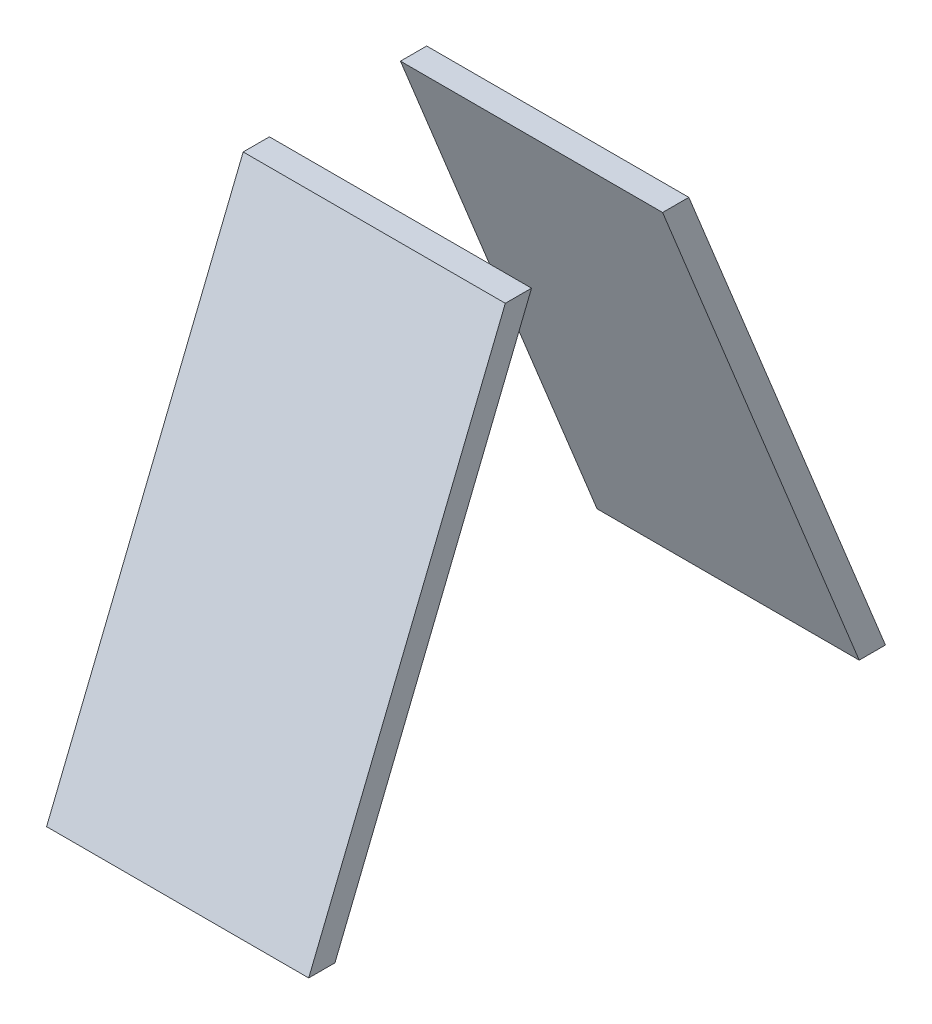
ISO-10303-21;
HEADER;
FILE_DESCRIPTION(('STEP AP214'),'2;1');
FILE_NAME('part.step','',(''),(''),'','','');
FILE_SCHEMA(('AUTOMOTIVE_DESIGN { 1 0 10303 214 1 1 1 1 }'));
ENDSEC;
DATA;
#1=APPLICATION_CONTEXT('core data for automotive mechanical design processes');
#2=APPLICATION_PROTOCOL_DEFINITION('international standard','automotive_design',2000,#1);
#3=PRODUCT_CONTEXT('',#1,'mechanical');
#4=PRODUCT('Part','Part','',(#3));
#5=PRODUCT_RELATED_PRODUCT_CATEGORY('part','',(#4));
#6=PRODUCT_DEFINITION_FORMATION('','',#4);
#7=PRODUCT_DEFINITION_CONTEXT('part definition',#1,'design');
#8=PRODUCT_DEFINITION('design','',#6,#7);
#9=PRODUCT_DEFINITION_SHAPE('','',#8);
#10=(LENGTH_UNIT() NAMED_UNIT(*) SI_UNIT(.MILLI.,.METRE.));
#11=(NAMED_UNIT(*) PLANE_ANGLE_UNIT() SI_UNIT($,.RADIAN.));
#12=(NAMED_UNIT(*) SI_UNIT($,.STERADIAN.) SOLID_ANGLE_UNIT());
#13=UNCERTAINTY_MEASURE_WITH_UNIT(LENGTH_MEASURE(1.E-05),#10,'distance_accuracy_value','');
#14=(GEOMETRIC_REPRESENTATION_CONTEXT(3) GLOBAL_UNCERTAINTY_ASSIGNED_CONTEXT((#13)) GLOBAL_UNIT_ASSIGNED_CONTEXT((#10,
#11,#12)) REPRESENTATION_CONTEXT('',''));
#15=CARTESIAN_POINT('',(0.,0.,0.));
#16=DIRECTION('',(0.,0.,1.));
#17=DIRECTION('',(1.,0.,0.));
#18=AXIS2_PLACEMENT_3D('',#15,#16,#17);
#19=CARTESIAN_POINT('',(100.,50.,-25.));
#20=DIRECTION('',(0.,0.375,-0.927024810886958));
#21=DIRECTION('',(0.,0.927024810886958,0.375));
#22=AXIS2_PLACEMENT_3D('',#19,#20,#21);
#23=PLANE('',#22);
#24=DIRECTION('',(0.,-0.927024810886958,-0.375));
#25=VECTOR('',#24,1.);
#26=CARTESIAN_POINT('',(0.,50.,-25.));
#27=LINE('',#26,#25);
#28=CARTESIAN_POINT('',(0.,50.,-25.));
#29=VERTEX_POINT('',#28);
#30=CARTESIAN_POINT('',(0.,-135.404962177392,-100.));
#31=VERTEX_POINT('',#30);
#32=EDGE_CURVE('E110',#29,#31,#27,.T.);
#33=ORIENTED_EDGE('',*,*,#32,.T.);
#34=DIRECTION('',(-1.,0.,0.));
#35=VECTOR('',#34,1.);
#36=CARTESIAN_POINT('',(100.,-135.404962177392,-100.));
#37=LINE('',#36,#35);
#38=CARTESIAN_POINT('',(100.,-135.404962177392,-100.));
#39=VERTEX_POINT('',#38);
#40=EDGE_CURVE('E12',#39,#31,#37,.T.);
#41=ORIENTED_EDGE('',*,*,#40,.F.);
#42=DIRECTION('',(0.,-0.927024810886958,-0.375));
#43=VECTOR('',#42,1.);
#44=CARTESIAN_POINT('',(100.,50.,-25.));
#45=LINE('',#44,#43);
#46=CARTESIAN_POINT('',(100.,50.,-25.));
#47=VERTEX_POINT('',#46);
#48=EDGE_CURVE('E98',#47,#39,#45,.T.);
#49=ORIENTED_EDGE('',*,*,#48,.F.);
#50=DIRECTION('',(-1.,0.,0.));
#51=VECTOR('',#50,1.);
#52=CARTESIAN_POINT('',(100.,50.,-25.));
#53=LINE('',#52,#51);
#54=EDGE_CURVE('E106',#47,#29,#53,.T.);
#55=ORIENTED_EDGE('',*,*,#54,.T.);
#56=EDGE_LOOP('',(#33,#41,#49,#55));
#57=FACE_BOUND('',#56,.T.);
#58=ADVANCED_FACE('F47',(#57),#23,.F.);
#59=CARTESIAN_POINT('',(100.,-135.404962177392,-110.));
#60=DIRECTION('',(0.,1.,0.));
#61=DIRECTION('',(0.,0.,1.));
#62=AXIS2_PLACEMENT_3D('',#59,#60,#61);
#63=PLANE('',#62);
#64=DIRECTION('',(0.,0.,-1.));
#65=VECTOR('',#64,1.);
#66=CARTESIAN_POINT('',(0.,-135.404962177392,-110.));
#67=LINE('',#66,#65);
#68=CARTESIAN_POINT('',(0.,-135.404962177392,-110.));
#69=VERTEX_POINT('',#68);
#70=EDGE_CURVE('E102',#31,#69,#67,.T.);
#71=ORIENTED_EDGE('',*,*,#70,.T.);
#72=DIRECTION('',(-1.,0.,0.));
#73=VECTOR('',#72,1.);
#74=CARTESIAN_POINT('',(100.,-135.404962177392,-110.));
#75=LINE('',#74,#73);
#76=CARTESIAN_POINT('',(100.,-135.404962177392,-110.));
#77=VERTEX_POINT('',#76);
#78=EDGE_CURVE('E55',#77,#69,#75,.T.);
#79=ORIENTED_EDGE('',*,*,#78,.F.);
#80=DIRECTION('',(0.,0.,-1.));
#81=VECTOR('',#80,1.);
#82=CARTESIAN_POINT('',(100.,-135.404962177392,-110.));
#83=LINE('',#82,#81);
#84=EDGE_CURVE('E93',#39,#77,#83,.T.);
#85=ORIENTED_EDGE('',*,*,#84,.F.);
#86=ORIENTED_EDGE('',*,*,#40,.T.);
#87=EDGE_LOOP('',(#71,#79,#85,#86));
#88=FACE_BOUND('',#87,.T.);
#89=ADVANCED_FACE('F101',(#88),#63,.F.);
#90=CARTESIAN_POINT('',(100.,50.,-35.));
#91=DIRECTION('',(0.,-0.375,0.927024810886958));
#92=DIRECTION('',(0.,-0.927024810886958,-0.375));
#93=AXIS2_PLACEMENT_3D('',#90,#91,#92);
#94=PLANE('',#93);
#95=DIRECTION('',(0.,0.927024810886958,0.375));
#96=VECTOR('',#95,1.);
#97=CARTESIAN_POINT('',(0.,50.,-35.));
#98=LINE('',#97,#96);
#99=CARTESIAN_POINT('',(0.,50.,-35.));
#100=VERTEX_POINT('',#99);
#101=EDGE_CURVE('E80',#69,#100,#98,.T.);
#102=ORIENTED_EDGE('',*,*,#101,.T.);
#103=DIRECTION('',(-1.,0.,0.));
#104=VECTOR('',#103,1.);
#105=CARTESIAN_POINT('',(100.,50.,-35.));
#106=LINE('',#105,#104);
#107=CARTESIAN_POINT('',(100.,50.,-35.));
#108=VERTEX_POINT('',#107);
#109=EDGE_CURVE('E103',#108,#100,#106,.T.);
#110=ORIENTED_EDGE('',*,*,#109,.F.);
#111=DIRECTION('',(0.,0.927024810886958,0.375));
#112=VECTOR('',#111,1.);
#113=CARTESIAN_POINT('',(100.,50.,-35.));
#114=LINE('',#113,#112);
#115=EDGE_CURVE('E96',#77,#108,#114,.T.);
#116=ORIENTED_EDGE('',*,*,#115,.F.);
#117=ORIENTED_EDGE('',*,*,#78,.T.);
#118=EDGE_LOOP('',(#102,#110,#116,#117));
#119=FACE_BOUND('',#118,.T.);
#120=ADVANCED_FACE('F104',(#119),#94,.F.);
#121=CARTESIAN_POINT('',(100.,50.,-25.));
#122=DIRECTION('',(0.,-1.,0.));
#123=DIRECTION('',(0.,0.,-1.));
#124=AXIS2_PLACEMENT_3D('',#121,#122,#123);
#125=PLANE('',#124);
#126=DIRECTION('',(0.,0.,1.));
#127=VECTOR('',#126,1.);
#128=CARTESIAN_POINT('',(0.,50.,-25.));
#129=LINE('',#128,#127);
#130=EDGE_CURVE('E86',#100,#29,#129,.T.);
#131=ORIENTED_EDGE('',*,*,#130,.T.);
#132=ORIENTED_EDGE('',*,*,#54,.F.);
#133=DIRECTION('',(0.,0.,1.));
#134=VECTOR('',#133,1.);
#135=CARTESIAN_POINT('',(100.,50.,-25.));
#136=LINE('',#135,#134);
#137=EDGE_CURVE('E63',#108,#47,#136,.T.);
#138=ORIENTED_EDGE('',*,*,#137,.F.);
#139=ORIENTED_EDGE('',*,*,#109,.T.);
#140=EDGE_LOOP('',(#131,#132,#138,#139));
#141=FACE_BOUND('',#140,.T.);
#142=ADVANCED_FACE('F117',(#141),#125,.F.);
#143=CARTESIAN_POINT('',(100.,0.,0.));
#144=DIRECTION('',(-1.,0.,0.));
#145=DIRECTION('',(0.,0.,1.));
#146=AXIS2_PLACEMENT_3D('',#143,#144,#145);
#147=PLANE('',#146);
#148=ORIENTED_EDGE('',*,*,#48,.T.);
#149=ORIENTED_EDGE('',*,*,#84,.T.);
#150=ORIENTED_EDGE('',*,*,#115,.T.);
#151=ORIENTED_EDGE('',*,*,#137,.T.);
#152=EDGE_LOOP('',(#148,#149,#150,#151));
#153=FACE_BOUND('',#152,.T.);
#154=ADVANCED_FACE('F94',(#153),#147,.F.);
#155=CARTESIAN_POINT('',(0.,0.,0.));
#156=DIRECTION('',(-1.,0.,0.));
#157=DIRECTION('',(0.,0.,1.));
#158=AXIS2_PLACEMENT_3D('',#155,#156,#157);
#159=PLANE('',#158);
#160=ORIENTED_EDGE('',*,*,#32,.F.);
#161=ORIENTED_EDGE('',*,*,#130,.F.);
#162=ORIENTED_EDGE('',*,*,#101,.F.);
#163=ORIENTED_EDGE('',*,*,#70,.F.);
#164=EDGE_LOOP('',(#160,#161,#162,#163));
#165=FACE_BOUND('',#164,.T.);
#166=ADVANCED_FACE('F120',(#165),#159,.T.);
#167=CLOSED_SHELL('',(#58,#89,#120,#142,#154,#166));
#168=MANIFOLD_SOLID_BREP('B2',#167);
#169=CARTESIAN_POINT('',(100.,-135.404962177392,110.));
#170=DIRECTION('',(0.,1.,0.));
#171=DIRECTION('',(0.,0.,1.));
#172=AXIS2_PLACEMENT_3D('',#169,#170,#171);
#173=PLANE('',#172);
#174=DIRECTION('',(0.,0.,-1.));
#175=VECTOR('',#174,1.);
#176=CARTESIAN_POINT('',(0.,-135.404962177392,110.));
#177=LINE('',#176,#175);
#178=CARTESIAN_POINT('',(0.,-135.404962177392,110.));
#179=VERTEX_POINT('',#178);
#180=CARTESIAN_POINT('',(0.,-135.404962177392,100.));
#181=VERTEX_POINT('',#180);
#182=EDGE_CURVE('E234',#179,#181,#177,.T.);
#183=ORIENTED_EDGE('',*,*,#182,.T.);
#184=DIRECTION('',(-1.,0.,0.));
#185=VECTOR('',#184,1.);
#186=CARTESIAN_POINT('',(100.,-135.404962177392,100.));
#187=LINE('',#186,#185);
#188=CARTESIAN_POINT('',(100.,-135.404962177392,100.));
#189=VERTEX_POINT('',#188);
#190=EDGE_CURVE('E45',#189,#181,#187,.T.);
#191=ORIENTED_EDGE('',*,*,#190,.F.);
#192=DIRECTION('',(0.,0.,-1.));
#193=VECTOR('',#192,1.);
#194=CARTESIAN_POINT('',(100.,-135.404962177392,110.));
#195=LINE('',#194,#193);
#196=CARTESIAN_POINT('',(100.,-135.404962177392,110.));
#197=VERTEX_POINT('',#196);
#198=EDGE_CURVE('E222',#197,#189,#195,.T.);
#199=ORIENTED_EDGE('',*,*,#198,.F.);
#200=DIRECTION('',(-1.,0.,0.));
#201=VECTOR('',#200,1.);
#202=CARTESIAN_POINT('',(100.,-135.404962177392,110.));
#203=LINE('',#202,#201);
#204=EDGE_CURVE('E230',#197,#179,#203,.T.);
#205=ORIENTED_EDGE('',*,*,#204,.T.);
#206=EDGE_LOOP('',(#183,#191,#199,#205));
#207=FACE_BOUND('',#206,.T.);
#208=ADVANCED_FACE('F171',(#207),#173,.F.);
#209=CARTESIAN_POINT('',(100.,50.,25.));
#210=DIRECTION('',(0.,0.375,0.927024810886958));
#211=DIRECTION('',(0.,-0.927024810886958,0.375));
#212=AXIS2_PLACEMENT_3D('',#209,#210,#211);
#213=PLANE('',#212);
#214=DIRECTION('',(0.,0.927024810886958,-0.375));
#215=VECTOR('',#214,1.);
#216=CARTESIAN_POINT('',(0.,50.,25.));
#217=LINE('',#216,#215);
#218=CARTESIAN_POINT('',(0.,50.,25.));
#219=VERTEX_POINT('',#218);
#220=EDGE_CURVE('E226',#181,#219,#217,.T.);
#221=ORIENTED_EDGE('',*,*,#220,.T.);
#222=DIRECTION('',(-1.,0.,0.));
#223=VECTOR('',#222,1.);
#224=CARTESIAN_POINT('',(100.,50.,25.));
#225=LINE('',#224,#223);
#226=CARTESIAN_POINT('',(100.,50.,25.));
#227=VERTEX_POINT('',#226);
#228=EDGE_CURVE('E179',#227,#219,#225,.T.);
#229=ORIENTED_EDGE('',*,*,#228,.F.);
#230=DIRECTION('',(0.,0.927024810886958,-0.375));
#231=VECTOR('',#230,1.);
#232=CARTESIAN_POINT('',(100.,50.,25.));
#233=LINE('',#232,#231);
#234=EDGE_CURVE('E217',#189,#227,#233,.T.);
#235=ORIENTED_EDGE('',*,*,#234,.F.);
#236=ORIENTED_EDGE('',*,*,#190,.T.);
#237=EDGE_LOOP('',(#221,#229,#235,#236));
#238=FACE_BOUND('',#237,.T.);
#239=ADVANCED_FACE('F225',(#238),#213,.F.);
#240=CARTESIAN_POINT('',(100.,50.,25.));
#241=DIRECTION('',(0.,-1.,0.));
#242=DIRECTION('',(0.,0.,-1.));
#243=AXIS2_PLACEMENT_3D('',#240,#241,#242);
#244=PLANE('',#243);
#245=DIRECTION('',(0.,0.,1.));
#246=VECTOR('',#245,1.);
#247=CARTESIAN_POINT('',(0.,50.,25.));
#248=LINE('',#247,#246);
#249=CARTESIAN_POINT('',(0.,50.,35.));
#250=VERTEX_POINT('',#249);
#251=EDGE_CURVE('E204',#219,#250,#248,.T.);
#252=ORIENTED_EDGE('',*,*,#251,.T.);
#253=DIRECTION('',(-1.,0.,0.));
#254=VECTOR('',#253,1.);
#255=CARTESIAN_POINT('',(100.,50.,35.));
#256=LINE('',#255,#254);
#257=CARTESIAN_POINT('',(100.,50.,35.));
#258=VERTEX_POINT('',#257);
#259=EDGE_CURVE('E227',#258,#250,#256,.T.);
#260=ORIENTED_EDGE('',*,*,#259,.F.);
#261=DIRECTION('',(0.,0.,1.));
#262=VECTOR('',#261,1.);
#263=CARTESIAN_POINT('',(100.,50.,25.));
#264=LINE('',#263,#262);
#265=EDGE_CURVE('E220',#227,#258,#264,.T.);
#266=ORIENTED_EDGE('',*,*,#265,.F.);
#267=ORIENTED_EDGE('',*,*,#228,.T.);
#268=EDGE_LOOP('',(#252,#260,#266,#267));
#269=FACE_BOUND('',#268,.T.);
#270=ADVANCED_FACE('F228',(#269),#244,.F.);
#271=CARTESIAN_POINT('',(100.,50.,35.));
#272=DIRECTION('',(0.,-0.375,-0.927024810886958));
#273=DIRECTION('',(0.,0.927024810886958,-0.375));
#274=AXIS2_PLACEMENT_3D('',#271,#272,#273);
#275=PLANE('',#274);
#276=DIRECTION('',(0.,-0.927024810886958,0.375));
#277=VECTOR('',#276,1.);
#278=CARTESIAN_POINT('',(0.,50.,35.));
#279=LINE('',#278,#277);
#280=EDGE_CURVE('E210',#250,#179,#279,.T.);
#281=ORIENTED_EDGE('',*,*,#280,.T.);
#282=ORIENTED_EDGE('',*,*,#204,.F.);
#283=DIRECTION('',(0.,-0.927024810886958,0.375));
#284=VECTOR('',#283,1.);
#285=CARTESIAN_POINT('',(100.,50.,35.));
#286=LINE('',#285,#284);
#287=EDGE_CURVE('E187',#258,#197,#286,.T.);
#288=ORIENTED_EDGE('',*,*,#287,.F.);
#289=ORIENTED_EDGE('',*,*,#259,.T.);
#290=EDGE_LOOP('',(#281,#282,#288,#289));
#291=FACE_BOUND('',#290,.T.);
#292=ADVANCED_FACE('F241',(#291),#275,.F.);
#293=CARTESIAN_POINT('',(100.,0.,0.));
#294=DIRECTION('',(-1.,0.,0.));
#295=DIRECTION('',(0.,0.,1.));
#296=AXIS2_PLACEMENT_3D('',#293,#294,#295);
#297=PLANE('',#296);
#298=ORIENTED_EDGE('',*,*,#198,.T.);
#299=ORIENTED_EDGE('',*,*,#234,.T.);
#300=ORIENTED_EDGE('',*,*,#265,.T.);
#301=ORIENTED_EDGE('',*,*,#287,.T.);
#302=EDGE_LOOP('',(#298,#299,#300,#301));
#303=FACE_BOUND('',#302,.T.);
#304=ADVANCED_FACE('F218',(#303),#297,.F.);
#305=CARTESIAN_POINT('',(0.,0.,0.));
#306=DIRECTION('',(-1.,0.,0.));
#307=DIRECTION('',(0.,0.,1.));
#308=AXIS2_PLACEMENT_3D('',#305,#306,#307);
#309=PLANE('',#308);
#310=ORIENTED_EDGE('',*,*,#182,.F.);
#311=ORIENTED_EDGE('',*,*,#280,.F.);
#312=ORIENTED_EDGE('',*,*,#251,.F.);
#313=ORIENTED_EDGE('',*,*,#220,.F.);
#314=EDGE_LOOP('',(#310,#311,#312,#313));
#315=FACE_BOUND('',#314,.T.);
#316=ADVANCED_FACE('F244',(#315),#309,.T.);
#317=CLOSED_SHELL('',(#208,#239,#270,#292,#304,#316));
#318=MANIFOLD_SOLID_BREP('B6',#317);
#319=ADVANCED_BREP_SHAPE_REPRESENTATION('',(#18,#168,#318),#14);
#320=SHAPE_DEFINITION_REPRESENTATION(#9,#319);
ENDSEC;
END-ISO-10303-21;
